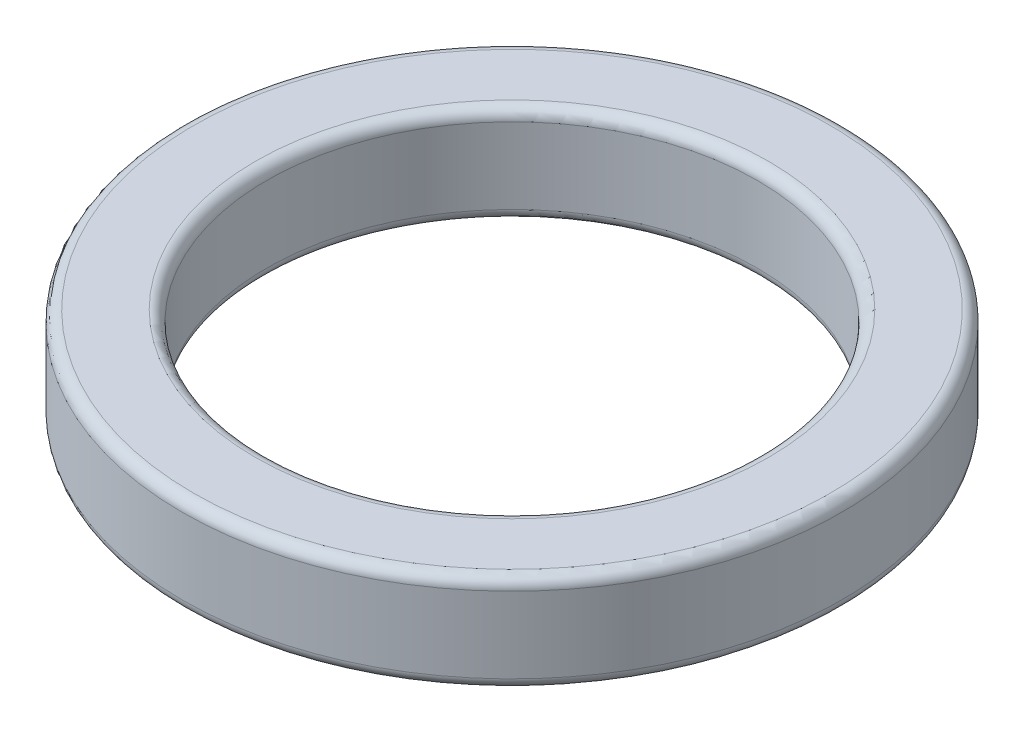
ISO-10303-21;
HEADER;
FILE_DESCRIPTION(('STEP AP214'),'2;1');
FILE_NAME('part.step','',(''),(''),'','','');
FILE_SCHEMA(('AUTOMOTIVE_DESIGN { 1 0 10303 214 1 1 1 1 }'));
ENDSEC;
DATA;
#1=APPLICATION_CONTEXT('core data for automotive mechanical design processes');
#2=APPLICATION_PROTOCOL_DEFINITION('international standard','automotive_design',2000,#1);
#3=PRODUCT_CONTEXT('',#1,'mechanical');
#4=PRODUCT('Part','Part','',(#3));
#5=PRODUCT_RELATED_PRODUCT_CATEGORY('part','',(#4));
#6=PRODUCT_DEFINITION_FORMATION('','',#4);
#7=PRODUCT_DEFINITION_CONTEXT('part definition',#1,'design');
#8=PRODUCT_DEFINITION('design','',#6,#7);
#9=PRODUCT_DEFINITION_SHAPE('','',#8);
#10=(LENGTH_UNIT() NAMED_UNIT(*) SI_UNIT(.MILLI.,.METRE.));
#11=(NAMED_UNIT(*) PLANE_ANGLE_UNIT() SI_UNIT($,.RADIAN.));
#12=(NAMED_UNIT(*) SI_UNIT($,.STERADIAN.) SOLID_ANGLE_UNIT());
#13=UNCERTAINTY_MEASURE_WITH_UNIT(LENGTH_MEASURE(1.E-05),#10,'distance_accuracy_value','');
#14=(GEOMETRIC_REPRESENTATION_CONTEXT(3) GLOBAL_UNCERTAINTY_ASSIGNED_CONTEXT((#13)) GLOBAL_UNIT_ASSIGNED_CONTEXT((#10,
#11,#12)) REPRESENTATION_CONTEXT('',''));
#15=CARTESIAN_POINT('',(0.,0.,0.));
#16=DIRECTION('',(0.,0.,1.));
#17=DIRECTION('',(1.,0.,0.));
#18=AXIS2_PLACEMENT_3D('',#15,#16,#17);
#19=CARTESIAN_POINT('',(0.,3.5,0.));
#20=DIRECTION('',(0.,1.,0.));
#21=DIRECTION('',(0.,0.,1.));
#22=AXIS2_PLACEMENT_3D('',#19,#20,#21);
#23=PLANE('',#22);
#24=CARTESIAN_POINT('',(0.,3.5,0.));
#25=DIRECTION('',(0.,1.,0.));
#26=DIRECTION('',(0.,0.,1.));
#27=AXIS2_PLACEMENT_3D('',#24,#25,#26);
#28=CIRCLE('',#27,18.29375);
#29=CARTESIAN_POINT('',(0.,3.5,18.29375));
#30=VERTEX_POINT('',#29);
#31=EDGE_CURVE('E10',#30,#30,#28,.F.);
#32=ORIENTED_EDGE('',*,*,#31,.T.);
#33=EDGE_LOOP('',(#32));
#34=FACE_BOUND('',#33,.T.);
#35=CARTESIAN_POINT('',(0.,3.5,0.));
#36=DIRECTION('',(0.,1.,0.));
#37=DIRECTION('',(0.,0.,1.));
#38=AXIS2_PLACEMENT_3D('',#35,#36,#37);
#39=CIRCLE('',#38,22.70625);
#40=CARTESIAN_POINT('',(0.,3.5,22.70625));
#41=VERTEX_POINT('',#40);
#42=EDGE_CURVE('E40',#41,#41,#39,.T.);
#43=ORIENTED_EDGE('',*,*,#42,.T.);
#44=EDGE_LOOP('',(#43));
#45=FACE_BOUND('',#44,.T.);
#46=ADVANCED_FACE('F33',(#34,#45),#23,.T.);
#47=CARTESIAN_POINT('',(0.,-3.5,0.));
#48=DIRECTION('',(0.,1.,0.));
#49=DIRECTION('',(0.,0.,1.));
#50=AXIS2_PLACEMENT_3D('',#47,#48,#49);
#51=PLANE('',#50);
#52=CARTESIAN_POINT('',(0.,-3.5,0.));
#53=DIRECTION('',(0.,1.,0.));
#54=DIRECTION('',(0.,0.,1.));
#55=AXIS2_PLACEMENT_3D('',#52,#53,#54);
#56=CIRCLE('',#55,18.29375);
#57=CARTESIAN_POINT('',(0.,-3.5,18.29375));
#58=VERTEX_POINT('',#57);
#59=EDGE_CURVE('E59',#58,#58,#56,.T.);
#60=ORIENTED_EDGE('',*,*,#59,.T.);
#61=EDGE_LOOP('',(#60));
#62=FACE_BOUND('',#61,.T.);
#63=CARTESIAN_POINT('',(0.,-3.5,0.));
#64=DIRECTION('',(0.,1.,0.));
#65=DIRECTION('',(0.,0.,1.));
#66=AXIS2_PLACEMENT_3D('',#63,#64,#65);
#67=CIRCLE('',#66,22.70625);
#68=CARTESIAN_POINT('',(0.,-3.5,22.70625));
#69=VERTEX_POINT('',#68);
#70=EDGE_CURVE('E62',#69,#69,#67,.F.);
#71=ORIENTED_EDGE('',*,*,#70,.T.);
#72=EDGE_LOOP('',(#71));
#73=FACE_BOUND('',#72,.T.);
#74=ADVANCED_FACE('F66',(#62,#73),#51,.F.);
#75=CARTESIAN_POINT('',(0.,3.5,0.));
#76=DIRECTION('',(0.,-1.,0.));
#77=DIRECTION('',(0.,0.,-1.));
#78=AXIS2_PLACEMENT_3D('',#75,#76,#77);
#79=CYLINDRICAL_SURFACE('',#78,23.5);
#80=CARTESIAN_POINT('',(0.,-2.70625,0.));
#81=DIRECTION('',(0.,1.,0.));
#82=DIRECTION('',(0.,0.,1.));
#83=AXIS2_PLACEMENT_3D('',#80,#81,#82);
#84=CIRCLE('',#83,23.5);
#85=CARTESIAN_POINT('',(0.,-2.70625,23.5));
#86=VERTEX_POINT('',#85);
#87=EDGE_CURVE('E44',#86,#86,#84,.T.);
#88=ORIENTED_EDGE('',*,*,#87,.T.);
#89=EDGE_LOOP('',(#88));
#90=FACE_BOUND('',#89,.T.);
#91=CARTESIAN_POINT('',(0.,2.70625,0.));
#92=DIRECTION('',(0.,1.,0.));
#93=DIRECTION('',(0.,0.,1.));
#94=AXIS2_PLACEMENT_3D('',#91,#92,#93);
#95=CIRCLE('',#94,23.5);
#96=CARTESIAN_POINT('',(0.,2.70625,23.5));
#97=VERTEX_POINT('',#96);
#98=EDGE_CURVE('E48',#97,#97,#95,.F.);
#99=ORIENTED_EDGE('',*,*,#98,.T.);
#100=EDGE_LOOP('',(#99));
#101=FACE_BOUND('',#100,.T.);
#102=ADVANCED_FACE('F76',(#90,#101),#79,.T.);
#103=CARTESIAN_POINT('',(0.,3.5,0.));
#104=DIRECTION('',(0.,-1.,0.));
#105=DIRECTION('',(0.,0.,-1.));
#106=AXIS2_PLACEMENT_3D('',#103,#104,#105);
#107=CYLINDRICAL_SURFACE('',#106,17.5);
#108=CARTESIAN_POINT('',(0.,-2.70625,0.));
#109=DIRECTION('',(0.,1.,0.));
#110=DIRECTION('',(0.,0.,1.));
#111=AXIS2_PLACEMENT_3D('',#108,#109,#110);
#112=CIRCLE('',#111,17.5);
#113=CARTESIAN_POINT('',(0.,-2.70625,17.5));
#114=VERTEX_POINT('',#113);
#115=EDGE_CURVE('E53',#114,#114,#112,.F.);
#116=ORIENTED_EDGE('',*,*,#115,.T.);
#117=EDGE_LOOP('',(#116));
#118=FACE_BOUND('',#117,.T.);
#119=CARTESIAN_POINT('',(0.,2.70625,0.));
#120=DIRECTION('',(0.,1.,0.));
#121=DIRECTION('',(0.,0.,1.));
#122=AXIS2_PLACEMENT_3D('',#119,#120,#121);
#123=CIRCLE('',#122,17.5);
#124=CARTESIAN_POINT('',(0.,2.70625,17.5));
#125=VERTEX_POINT('',#124);
#126=EDGE_CURVE('E56',#125,#125,#123,.T.);
#127=ORIENTED_EDGE('',*,*,#126,.T.);
#128=EDGE_LOOP('',(#127));
#129=FACE_BOUND('',#128,.T.);
#130=ADVANCED_FACE('F79',(#118,#129),#107,.F.);
#131=CARTESIAN_POINT('',(0.,-2.70625,0.));
#132=DIRECTION('',(0.,1.,0.));
#133=DIRECTION('',(0.,0.,1.));
#134=AXIS2_PLACEMENT_3D('',#131,#132,#133);
#135=TOROIDAL_SURFACE('',#134,18.29375,0.79375);
#136=ORIENTED_EDGE('',*,*,#115,.F.);
#137=EDGE_LOOP('',(#136));
#138=FACE_BOUND('',#137,.T.);
#139=ORIENTED_EDGE('',*,*,#59,.F.);
#140=EDGE_LOOP('',(#139));
#141=FACE_BOUND('',#140,.T.);
#142=ADVANCED_FACE('F72',(#138,#141),#135,.T.);
#143=CARTESIAN_POINT('',(0.,-2.70625,0.));
#144=DIRECTION('',(0.,1.,0.));
#145=DIRECTION('',(0.,0.,1.));
#146=AXIS2_PLACEMENT_3D('',#143,#144,#145);
#147=TOROIDAL_SURFACE('',#146,22.70625,0.79375);
#148=ORIENTED_EDGE('',*,*,#70,.F.);
#149=EDGE_LOOP('',(#148));
#150=FACE_BOUND('',#149,.T.);
#151=ORIENTED_EDGE('',*,*,#87,.F.);
#152=EDGE_LOOP('',(#151));
#153=FACE_BOUND('',#152,.T.);
#154=ADVANCED_FACE('F68',(#150,#153),#147,.T.);
#155=CARTESIAN_POINT('',(0.,2.70625,0.));
#156=DIRECTION('',(0.,1.,0.));
#157=DIRECTION('',(0.,0.,1.));
#158=AXIS2_PLACEMENT_3D('',#155,#156,#157);
#159=TOROIDAL_SURFACE('',#158,18.29375,0.79375);
#160=ORIENTED_EDGE('',*,*,#31,.F.);
#161=EDGE_LOOP('',(#160));
#162=FACE_BOUND('',#161,.T.);
#163=ORIENTED_EDGE('',*,*,#126,.F.);
#164=EDGE_LOOP('',(#163));
#165=FACE_BOUND('',#164,.T.);
#166=ADVANCED_FACE('F71',(#162,#165),#159,.T.);
#167=CARTESIAN_POINT('',(0.,2.70625,0.));
#168=DIRECTION('',(0.,1.,0.));
#169=DIRECTION('',(0.,0.,1.));
#170=AXIS2_PLACEMENT_3D('',#167,#168,#169);
#171=TOROIDAL_SURFACE('',#170,22.70625,0.79375);
#172=ORIENTED_EDGE('',*,*,#98,.F.);
#173=EDGE_LOOP('',(#172));
#174=FACE_BOUND('',#173,.T.);
#175=ORIENTED_EDGE('',*,*,#42,.F.);
#176=EDGE_LOOP('',(#175));
#177=FACE_BOUND('',#176,.T.);
#178=ADVANCED_FACE('F35',(#174,#177),#171,.T.);
#179=CLOSED_SHELL('',(#46,#74,#102,#130,#142,#154,#166,#178));
#180=MANIFOLD_SOLID_BREP('B2',#179);
#181=ADVANCED_BREP_SHAPE_REPRESENTATION('',(#18,#180),#14);
#182=SHAPE_DEFINITION_REPRESENTATION(#9,#181);
ENDSEC;
END-ISO-10303-21;
